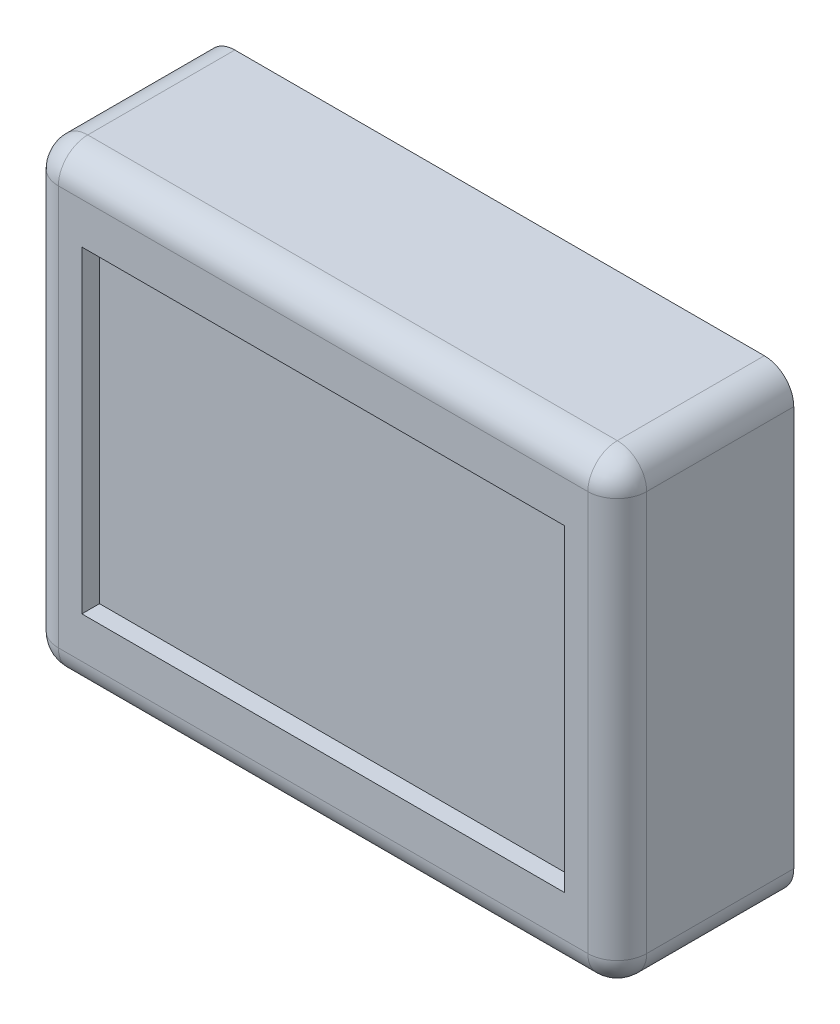
ISO-10303-21;
HEADER;
FILE_DESCRIPTION(('STEP AP214'),'2;1');
FILE_NAME('part.step','',(''),(''),'','','');
FILE_SCHEMA(('AUTOMOTIVE_DESIGN { 1 0 10303 214 1 1 1 1 }'));
ENDSEC;
DATA;
#1=APPLICATION_CONTEXT('core data for automotive mechanical design processes');
#2=APPLICATION_PROTOCOL_DEFINITION('international standard','automotive_design',2000,#1);
#3=PRODUCT_CONTEXT('',#1,'mechanical');
#4=PRODUCT('Part','Part','',(#3));
#5=PRODUCT_RELATED_PRODUCT_CATEGORY('part','',(#4));
#6=PRODUCT_DEFINITION_FORMATION('','',#4);
#7=PRODUCT_DEFINITION_CONTEXT('part definition',#1,'design');
#8=PRODUCT_DEFINITION('design','',#6,#7);
#9=PRODUCT_DEFINITION_SHAPE('','',#8);
#10=(LENGTH_UNIT() NAMED_UNIT(*) SI_UNIT(.MILLI.,.METRE.));
#11=(NAMED_UNIT(*) PLANE_ANGLE_UNIT() SI_UNIT($,.RADIAN.));
#12=(NAMED_UNIT(*) SI_UNIT($,.STERADIAN.) SOLID_ANGLE_UNIT());
#13=UNCERTAINTY_MEASURE_WITH_UNIT(LENGTH_MEASURE(1.E-05),#10,'distance_accuracy_value','');
#14=(GEOMETRIC_REPRESENTATION_CONTEXT(3) GLOBAL_UNCERTAINTY_ASSIGNED_CONTEXT((#13)) GLOBAL_UNIT_ASSIGNED_CONTEXT((#10,
#11,#12)) REPRESENTATION_CONTEXT('',''));
#15=CARTESIAN_POINT('',(0.,0.,0.));
#16=DIRECTION('',(0.,0.,1.));
#17=DIRECTION('',(1.,0.,0.));
#18=AXIS2_PLACEMENT_3D('',#15,#16,#17);
#19=CARTESIAN_POINT('',(58.1192235973719,-23.7460815047022,-30.));
#20=DIRECTION('',(1.,0.,0.));
#21=DIRECTION('',(0.,1.,0.));
#22=AXIS2_PLACEMENT_3D('',#19,#20,#21);
#23=PLANE('',#22);
#24=DIRECTION('',(0.,1.,0.));
#25=VECTOR('',#24,1.);
#26=CARTESIAN_POINT('',(58.1192235973719,-23.7460815047022,-5.));
#27=LINE('',#26,#25);
#28=CARTESIAN_POINT('',(58.1192235973719,49.2539184952978,-5.));
#29=VERTEX_POINT('',#28);
#30=CARTESIAN_POINT('',(58.1192235973719,-18.7460815047022,-5.));
#31=VERTEX_POINT('',#30);
#32=EDGE_CURVE('E324',#29,#31,#27,.F.);
#33=ORIENTED_EDGE('',*,*,#32,.T.);
#34=DIRECTION('',(0.,0.,1.));
#35=VECTOR('',#34,1.);
#36=CARTESIAN_POINT('',(58.1192235973719,-18.7460815047022,-30.));
#37=LINE('',#36,#35);
#38=CARTESIAN_POINT('',(58.1192235973719,-18.7460815047022,-30.));
#39=VERTEX_POINT('',#38);
#40=EDGE_CURVE('E328',#31,#39,#37,.F.);
#41=ORIENTED_EDGE('',*,*,#40,.T.);
#42=DIRECTION('',(0.,1.,0.));
#43=VECTOR('',#42,1.);
#44=CARTESIAN_POINT('',(58.1192235973719,-23.7460815047022,-30.));
#45=LINE('',#44,#43);
#46=CARTESIAN_POINT('',(58.1192235973719,49.2539184952978,-30.));
#47=VERTEX_POINT('',#46);
#48=EDGE_CURVE('E299',#39,#47,#45,.T.);
#49=ORIENTED_EDGE('',*,*,#48,.T.);
#50=DIRECTION('',(0.,0.,1.));
#51=VECTOR('',#50,1.);
#52=CARTESIAN_POINT('',(58.1192235973719,49.2539184952978,-30.));
#53=LINE('',#52,#51);
#54=EDGE_CURVE('E326',#47,#29,#53,.T.);
#55=ORIENTED_EDGE('',*,*,#54,.T.);
#56=EDGE_LOOP('',(#33,#41,#49,#55));
#57=FACE_BOUND('',#56,.T.);
#58=ADVANCED_FACE('F39',(#57),#23,.T.);
#59=CARTESIAN_POINT('',(-41.8807764026281,-23.7460815047022,-30.));
#60=DIRECTION('',(0.,-1.,0.));
#61=DIRECTION('',(0.,0.,-1.));
#62=AXIS2_PLACEMENT_3D('',#59,#60,#61);
#63=PLANE('',#62);
#64=DIRECTION('',(1.,0.,0.));
#65=VECTOR('',#64,1.);
#66=CARTESIAN_POINT('',(-41.8807764026281,-23.7460815047022,-30.));
#67=LINE('',#66,#65);
#68=CARTESIAN_POINT('',(-36.8807764026281,-23.7460815047022,-30.));
#69=VERTEX_POINT('',#68);
#70=CARTESIAN_POINT('',(53.1192235973719,-23.7460815047022,-30.));
#71=VERTEX_POINT('',#70);
#72=EDGE_CURVE('E314',#69,#71,#67,.T.);
#73=ORIENTED_EDGE('',*,*,#72,.T.);
#74=DIRECTION('',(0.,0.,1.));
#75=VECTOR('',#74,1.);
#76=CARTESIAN_POINT('',(53.1192235973719,-23.7460815047022,-30.));
#77=LINE('',#76,#75);
#78=CARTESIAN_POINT('',(53.1192235973719,-23.7460815047022,-5.));
#79=VERTEX_POINT('',#78);
#80=EDGE_CURVE('E321',#71,#79,#77,.T.);
#81=ORIENTED_EDGE('',*,*,#80,.T.);
#82=DIRECTION('',(1.,0.,0.));
#83=VECTOR('',#82,1.);
#84=CARTESIAN_POINT('',(-41.8807764026281,-23.7460815047022,-5.));
#85=LINE('',#84,#83);
#86=CARTESIAN_POINT('',(-36.8807764026281,-23.7460815047022,-5.));
#87=VERTEX_POINT('',#86);
#88=EDGE_CURVE('E319',#79,#87,#85,.F.);
#89=ORIENTED_EDGE('',*,*,#88,.T.);
#90=DIRECTION('',(0.,0.,1.));
#91=VECTOR('',#90,1.);
#92=CARTESIAN_POINT('',(-36.8807764026281,-23.7460815047022,-30.));
#93=LINE('',#92,#91);
#94=EDGE_CURVE('E317',#87,#69,#93,.F.);
#95=ORIENTED_EDGE('',*,*,#94,.T.);
#96=EDGE_LOOP('',(#73,#81,#89,#95));
#97=FACE_BOUND('',#96,.T.);
#98=ADVANCED_FACE('F445',(#97),#63,.T.);
#99=CARTESIAN_POINT('',(-41.8807764026281,54.2539184952978,-30.));
#100=DIRECTION('',(-1.,0.,0.));
#101=DIRECTION('',(0.,-1.,0.));
#102=AXIS2_PLACEMENT_3D('',#99,#100,#101);
#103=PLANE('',#102);
#104=DIRECTION('',(0.,-1.,0.));
#105=VECTOR('',#104,1.);
#106=CARTESIAN_POINT('',(-41.8807764026281,54.2539184952978,-30.));
#107=LINE('',#106,#105);
#108=CARTESIAN_POINT('',(-41.8807764026281,49.2539184952978,-30.));
#109=VERTEX_POINT('',#108);
#110=CARTESIAN_POINT('',(-41.8807764026281,-18.7460815047022,-30.));
#111=VERTEX_POINT('',#110);
#112=EDGE_CURVE('E311',#109,#111,#107,.T.);
#113=ORIENTED_EDGE('',*,*,#112,.T.);
#114=DIRECTION('',(0.,0.,1.));
#115=VECTOR('',#114,1.);
#116=CARTESIAN_POINT('',(-41.8807764026281,-18.7460815047022,-30.));
#117=LINE('',#116,#115);
#118=CARTESIAN_POINT('',(-41.8807764026281,-18.7460815047022,-5.));
#119=VERTEX_POINT('',#118);
#120=EDGE_CURVE('E351',#111,#119,#117,.T.);
#121=ORIENTED_EDGE('',*,*,#120,.T.);
#122=DIRECTION('',(0.,-1.,0.));
#123=VECTOR('',#122,1.);
#124=CARTESIAN_POINT('',(-41.8807764026281,54.2539184952978,-5.));
#125=LINE('',#124,#123);
#126=CARTESIAN_POINT('',(-41.8807764026281,49.2539184952978,-5.));
#127=VERTEX_POINT('',#126);
#128=EDGE_CURVE('E349',#119,#127,#125,.F.);
#129=ORIENTED_EDGE('',*,*,#128,.T.);
#130=DIRECTION('',(0.,0.,1.));
#131=VECTOR('',#130,1.);
#132=CARTESIAN_POINT('',(-41.8807764026281,49.2539184952978,-30.));
#133=LINE('',#132,#131);
#134=EDGE_CURVE('E347',#127,#109,#133,.F.);
#135=ORIENTED_EDGE('',*,*,#134,.T.);
#136=EDGE_LOOP('',(#113,#121,#129,#135));
#137=FACE_BOUND('',#136,.T.);
#138=ADVANCED_FACE('F452',(#137),#103,.T.);
#139=CARTESIAN_POINT('',(58.1192235973719,54.2539184952978,-30.));
#140=DIRECTION('',(0.,1.,0.));
#141=DIRECTION('',(-1.,0.,0.));
#142=AXIS2_PLACEMENT_3D('',#139,#140,#141);
#143=PLANE('',#142);
#144=DIRECTION('',(-1.,0.,0.));
#145=VECTOR('',#144,1.);
#146=CARTESIAN_POINT('',(58.1192235973719,54.2539184952978,-30.));
#147=LINE('',#146,#145);
#148=CARTESIAN_POINT('',(53.1192235973719,54.2539184952978,-30.));
#149=VERTEX_POINT('',#148);
#150=CARTESIAN_POINT('',(-36.8807764026281,54.2539184952978,-30.));
#151=VERTEX_POINT('',#150);
#152=EDGE_CURVE('E308',#149,#151,#147,.T.);
#153=ORIENTED_EDGE('',*,*,#152,.T.);
#154=DIRECTION('',(0.,0.,1.));
#155=VECTOR('',#154,1.);
#156=CARTESIAN_POINT('',(-36.8807764026281,54.2539184952978,-30.));
#157=LINE('',#156,#155);
#158=CARTESIAN_POINT('',(-36.8807764026281,54.2539184952978,-5.));
#159=VERTEX_POINT('',#158);
#160=EDGE_CURVE('E357',#151,#159,#157,.T.);
#161=ORIENTED_EDGE('',*,*,#160,.T.);
#162=DIRECTION('',(-1.,0.,0.));
#163=VECTOR('',#162,1.);
#164=CARTESIAN_POINT('',(58.1192235973719,54.2539184952978,-5.));
#165=LINE('',#164,#163);
#166=CARTESIAN_POINT('',(53.1192235973719,54.2539184952978,-5.));
#167=VERTEX_POINT('',#166);
#168=EDGE_CURVE('E353',#159,#167,#165,.F.);
#169=ORIENTED_EDGE('',*,*,#168,.T.);
#170=DIRECTION('',(0.,0.,1.));
#171=VECTOR('',#170,1.);
#172=CARTESIAN_POINT('',(53.1192235973719,54.2539184952978,-30.));
#173=LINE('',#172,#171);
#174=EDGE_CURVE('E355',#167,#149,#173,.F.);
#175=ORIENTED_EDGE('',*,*,#174,.T.);
#176=EDGE_LOOP('',(#153,#161,#169,#175));
#177=FACE_BOUND('',#176,.T.);
#178=ADVANCED_FACE('F457',(#177),#143,.T.);
#179=CARTESIAN_POINT('',(0.,0.,-30.));
#180=DIRECTION('',(0.,0.,1.));
#181=DIRECTION('',(1.,0.,0.));
#182=AXIS2_PLACEMENT_3D('',#179,#180,#181);
#183=PLANE('',#182);
#184=DIRECTION('',(1.,0.,0.));
#185=VECTOR('',#184,1.);
#186=CARTESIAN_POINT('',(0.,-20.7460815047022,-30.));
#187=LINE('',#186,#185);
#188=CARTESIAN_POINT('',(-38.8807764026281,-20.7460815047022,-30.));
#189=VERTEX_POINT('',#188);
#190=CARTESIAN_POINT('',(55.1192235973719,-20.7460815047022,-30.));
#191=VERTEX_POINT('',#190);
#192=EDGE_CURVE('E221',#189,#191,#187,.T.);
#193=ORIENTED_EDGE('',*,*,#192,.T.);
#194=DIRECTION('',(0.,1.,0.));
#195=VECTOR('',#194,1.);
#196=CARTESIAN_POINT('',(55.1192235973719,0.,-30.));
#197=LINE('',#196,#195);
#198=CARTESIAN_POINT('',(55.1192235973719,51.2539184952978,-30.));
#199=VERTEX_POINT('',#198);
#200=EDGE_CURVE('E230',#191,#199,#197,.T.);
#201=ORIENTED_EDGE('',*,*,#200,.T.);
#202=DIRECTION('',(-1.,0.,0.));
#203=VECTOR('',#202,1.);
#204=CARTESIAN_POINT('',(0.,51.2539184952978,-30.));
#205=LINE('',#204,#203);
#206=CARTESIAN_POINT('',(-38.8807764026281,51.2539184952978,-30.));
#207=VERTEX_POINT('',#206);
#208=EDGE_CURVE('E233',#199,#207,#205,.T.);
#209=ORIENTED_EDGE('',*,*,#208,.T.);
#210=DIRECTION('',(0.,-1.,0.));
#211=VECTOR('',#210,1.);
#212=CARTESIAN_POINT('',(-38.8807764026281,0.,-30.));
#213=LINE('',#212,#211);
#214=EDGE_CURVE('E269',#207,#189,#213,.T.);
#215=ORIENTED_EDGE('',*,*,#214,.T.);
#216=EDGE_LOOP('',(#193,#201,#209,#215));
#217=FACE_BOUND('',#216,.T.);
#218=ORIENTED_EDGE('',*,*,#48,.F.);
#219=CARTESIAN_POINT('',(53.1192235973719,-18.7460815047022,-30.));
#220=DIRECTION('',(0.,0.,1.));
#221=DIRECTION('',(1.,0.,0.));
#222=AXIS2_PLACEMENT_3D('',#219,#220,#221);
#223=CIRCLE('',#222,5.);
#224=EDGE_CURVE('E336',#39,#71,#223,.F.);
#225=ORIENTED_EDGE('',*,*,#224,.T.);
#226=ORIENTED_EDGE('',*,*,#72,.F.);
#227=CARTESIAN_POINT('',(-36.8807764026281,-18.7460815047022,-30.));
#228=DIRECTION('',(0.,0.,1.));
#229=DIRECTION('',(1.,0.,0.));
#230=AXIS2_PLACEMENT_3D('',#227,#228,#229);
#231=CIRCLE('',#230,5.);
#232=EDGE_CURVE('E334',#69,#111,#231,.F.);
#233=ORIENTED_EDGE('',*,*,#232,.T.);
#234=ORIENTED_EDGE('',*,*,#112,.F.);
#235=CARTESIAN_POINT('',(-36.8807764026281,49.2539184952978,-30.));
#236=DIRECTION('',(0.,0.,1.));
#237=DIRECTION('',(1.,0.,0.));
#238=AXIS2_PLACEMENT_3D('',#235,#236,#237);
#239=CIRCLE('',#238,5.);
#240=EDGE_CURVE('E332',#109,#151,#239,.F.);
#241=ORIENTED_EDGE('',*,*,#240,.T.);
#242=ORIENTED_EDGE('',*,*,#152,.F.);
#243=CARTESIAN_POINT('',(53.1192235973719,49.2539184952978,-30.));
#244=DIRECTION('',(0.,0.,1.));
#245=DIRECTION('',(1.,0.,0.));
#246=AXIS2_PLACEMENT_3D('',#243,#244,#245);
#247=CIRCLE('',#246,5.);
#248=EDGE_CURVE('E330',#149,#47,#247,.F.);
#249=ORIENTED_EDGE('',*,*,#248,.T.);
#250=EDGE_LOOP('',(#218,#225,#226,#233,#234,#241,#242,#249));
#251=FACE_BOUND('',#250,.T.);
#252=ADVANCED_FACE('F709',(#217,#251),#183,.F.);
#253=CARTESIAN_POINT('',(0.,0.,0.));
#254=DIRECTION('',(0.,0.,1.));
#255=DIRECTION('',(1.,0.,0.));
#256=AXIS2_PLACEMENT_3D('',#253,#254,#255);
#257=PLANE('',#256);
#258=DIRECTION('',(0.,-1.,0.));
#259=VECTOR('',#258,1.);
#260=CARTESIAN_POINT('',(-36.8807764026281,0.,0.));
#261=LINE('',#260,#259);
#262=CARTESIAN_POINT('',(-36.8807764026281,49.2539184952978,0.));
#263=VERTEX_POINT('',#262);
#264=CARTESIAN_POINT('',(-36.8807764026281,-18.7460815047022,0.));
#265=VERTEX_POINT('',#264);
#266=EDGE_CURVE('E342',#263,#265,#261,.T.);
#267=ORIENTED_EDGE('',*,*,#266,.T.);
#268=DIRECTION('',(1.,0.,0.));
#269=VECTOR('',#268,1.);
#270=CARTESIAN_POINT('',(0.,-18.7460815047022,0.));
#271=LINE('',#270,#269);
#272=CARTESIAN_POINT('',(53.1192235973719,-18.7460815047022,0.));
#273=VERTEX_POINT('',#272);
#274=EDGE_CURVE('E344',#265,#273,#271,.T.);
#275=ORIENTED_EDGE('',*,*,#274,.T.);
#276=DIRECTION('',(0.,1.,0.));
#277=VECTOR('',#276,1.);
#278=CARTESIAN_POINT('',(53.1192235973719,0.,0.));
#279=LINE('',#278,#277);
#280=CARTESIAN_POINT('',(53.1192235973719,49.2539184952978,0.));
#281=VERTEX_POINT('',#280);
#282=EDGE_CURVE('E338',#273,#281,#279,.T.);
#283=ORIENTED_EDGE('',*,*,#282,.T.);
#284=DIRECTION('',(-1.,0.,0.));
#285=VECTOR('',#284,1.);
#286=CARTESIAN_POINT('',(0.,49.2539184952978,0.));
#287=LINE('',#286,#285);
#288=EDGE_CURVE('E340',#281,#263,#287,.T.);
#289=ORIENTED_EDGE('',*,*,#288,.T.);
#290=EDGE_LOOP('',(#267,#275,#283,#289));
#291=FACE_BOUND('',#290,.T.);
#292=DIRECTION('',(0.,1.,0.));
#293=VECTOR('',#292,1.);
#294=CARTESIAN_POINT('',(49.1192235973719,-11.7460815047022,0.));
#295=LINE('',#294,#293);
#296=CARTESIAN_POINT('',(49.1192235973719,-11.7460815047022,0.));
#297=VERTEX_POINT('',#296);
#298=CARTESIAN_POINT('',(49.1192235973719,42.2539184952978,0.));
#299=VERTEX_POINT('',#298);
#300=EDGE_CURVE('E287',#297,#299,#295,.T.);
#301=ORIENTED_EDGE('',*,*,#300,.F.);
#302=DIRECTION('',(1.,0.,0.));
#303=VECTOR('',#302,1.);
#304=CARTESIAN_POINT('',(-32.8807764026281,-11.7460815047022,0.));
#305=LINE('',#304,#303);
#306=CARTESIAN_POINT('',(-32.8807764026281,-11.7460815047022,0.));
#307=VERTEX_POINT('',#306);
#308=EDGE_CURVE('E277',#307,#297,#305,.T.);
#309=ORIENTED_EDGE('',*,*,#308,.F.);
#310=DIRECTION('',(0.,-1.,0.));
#311=VECTOR('',#310,1.);
#312=CARTESIAN_POINT('',(-32.8807764026281,42.2539184952978,0.));
#313=LINE('',#312,#311);
#314=CARTESIAN_POINT('',(-32.8807764026281,42.2539184952978,0.));
#315=VERTEX_POINT('',#314);
#316=EDGE_CURVE('E292',#315,#307,#313,.T.);
#317=ORIENTED_EDGE('',*,*,#316,.F.);
#318=DIRECTION('',(-1.,0.,0.));
#319=VECTOR('',#318,1.);
#320=CARTESIAN_POINT('',(49.1192235973719,42.2539184952978,0.));
#321=LINE('',#320,#319);
#322=EDGE_CURVE('E289',#299,#315,#321,.T.);
#323=ORIENTED_EDGE('',*,*,#322,.F.);
#324=EDGE_LOOP('',(#301,#309,#317,#323));
#325=FACE_BOUND('',#324,.T.);
#326=ADVANCED_FACE('F701',(#291,#325),#257,.T.);
#327=CARTESIAN_POINT('',(49.1192235973719,-11.7460815047022,-3.));
#328=DIRECTION('',(1.,0.,0.));
#329=DIRECTION('',(0.,0.,-1.));
#330=AXIS2_PLACEMENT_3D('',#327,#328,#329);
#331=PLANE('',#330);
#332=ORIENTED_EDGE('',*,*,#300,.T.);
#333=DIRECTION('',(0.,0.,1.));
#334=VECTOR('',#333,1.);
#335=CARTESIAN_POINT('',(49.1192235973719,42.2539184952978,-3.));
#336=LINE('',#335,#334);
#337=CARTESIAN_POINT('',(49.1192235973719,42.2539184952978,-3.));
#338=VERTEX_POINT('',#337);
#339=EDGE_CURVE('E286',#338,#299,#336,.T.);
#340=ORIENTED_EDGE('',*,*,#339,.F.);
#341=DIRECTION('',(0.,1.,0.));
#342=VECTOR('',#341,1.);
#343=CARTESIAN_POINT('',(49.1192235973719,-11.7460815047022,-3.));
#344=LINE('',#343,#342);
#345=CARTESIAN_POINT('',(49.1192235973719,-11.7460815047022,-3.));
#346=VERTEX_POINT('',#345);
#347=EDGE_CURVE('E273',#346,#338,#344,.T.);
#348=ORIENTED_EDGE('',*,*,#347,.F.);
#349=DIRECTION('',(0.,0.,1.));
#350=VECTOR('',#349,1.);
#351=CARTESIAN_POINT('',(49.1192235973719,-11.7460815047022,-3.));
#352=LINE('',#351,#350);
#353=EDGE_CURVE('E297',#346,#297,#352,.T.);
#354=ORIENTED_EDGE('',*,*,#353,.T.);
#355=EDGE_LOOP('',(#332,#340,#348,#354));
#356=FACE_BOUND('',#355,.T.);
#357=ADVANCED_FACE('F692',(#356),#331,.F.);
#358=CARTESIAN_POINT('',(-32.8807764026281,-11.7460815047022,-3.));
#359=DIRECTION('',(0.,-1.,0.));
#360=DIRECTION('',(0.,0.,-1.));
#361=AXIS2_PLACEMENT_3D('',#358,#359,#360);
#362=PLANE('',#361);
#363=ORIENTED_EDGE('',*,*,#308,.T.);
#364=ORIENTED_EDGE('',*,*,#353,.F.);
#365=DIRECTION('',(1.,0.,0.));
#366=VECTOR('',#365,1.);
#367=CARTESIAN_POINT('',(-32.8807764026281,-11.7460815047022,-3.));
#368=LINE('',#367,#366);
#369=CARTESIAN_POINT('',(-32.8807764026281,-11.7460815047022,-3.));
#370=VERTEX_POINT('',#369);
#371=EDGE_CURVE('E283',#370,#346,#368,.T.);
#372=ORIENTED_EDGE('',*,*,#371,.F.);
#373=DIRECTION('',(0.,0.,1.));
#374=VECTOR('',#373,1.);
#375=CARTESIAN_POINT('',(-32.8807764026281,-11.7460815047022,-3.));
#376=LINE('',#375,#374);
#377=EDGE_CURVE('E300',#370,#307,#376,.T.);
#378=ORIENTED_EDGE('',*,*,#377,.T.);
#379=EDGE_LOOP('',(#363,#364,#372,#378));
#380=FACE_BOUND('',#379,.T.);
#381=ADVANCED_FACE('F683',(#380),#362,.F.);
#382=CARTESIAN_POINT('',(-32.8807764026281,42.2539184952978,-3.));
#383=DIRECTION('',(-1.,0.,0.));
#384=DIRECTION('',(0.,-1.,0.));
#385=AXIS2_PLACEMENT_3D('',#382,#383,#384);
#386=PLANE('',#385);
#387=ORIENTED_EDGE('',*,*,#316,.T.);
#388=ORIENTED_EDGE('',*,*,#377,.F.);
#389=DIRECTION('',(0.,-1.,0.));
#390=VECTOR('',#389,1.);
#391=CARTESIAN_POINT('',(-32.8807764026281,42.2539184952978,-3.));
#392=LINE('',#391,#390);
#393=CARTESIAN_POINT('',(-32.8807764026281,42.2539184952978,-3.));
#394=VERTEX_POINT('',#393);
#395=EDGE_CURVE('E280',#394,#370,#392,.T.);
#396=ORIENTED_EDGE('',*,*,#395,.F.);
#397=DIRECTION('',(0.,0.,1.));
#398=VECTOR('',#397,1.);
#399=CARTESIAN_POINT('',(-32.8807764026281,42.2539184952978,-3.));
#400=LINE('',#399,#398);
#401=EDGE_CURVE('E302',#394,#315,#400,.T.);
#402=ORIENTED_EDGE('',*,*,#401,.T.);
#403=EDGE_LOOP('',(#387,#388,#396,#402));
#404=FACE_BOUND('',#403,.T.);
#405=ADVANCED_FACE('F674',(#404),#386,.F.);
#406=CARTESIAN_POINT('',(49.1192235973719,42.2539184952978,-3.));
#407=DIRECTION('',(0.,1.,0.));
#408=DIRECTION('',(-1.,0.,0.));
#409=AXIS2_PLACEMENT_3D('',#406,#407,#408);
#410=PLANE('',#409);
#411=ORIENTED_EDGE('',*,*,#322,.T.);
#412=ORIENTED_EDGE('',*,*,#401,.F.);
#413=DIRECTION('',(-1.,0.,0.));
#414=VECTOR('',#413,1.);
#415=CARTESIAN_POINT('',(49.1192235973719,42.2539184952978,-3.));
#416=LINE('',#415,#414);
#417=EDGE_CURVE('E276',#338,#394,#416,.T.);
#418=ORIENTED_EDGE('',*,*,#417,.F.);
#419=ORIENTED_EDGE('',*,*,#339,.T.);
#420=EDGE_LOOP('',(#411,#412,#418,#419));
#421=FACE_BOUND('',#420,.T.);
#422=ADVANCED_FACE('F666',(#421),#410,.F.);
#423=CARTESIAN_POINT('',(0.,0.,-3.));
#424=DIRECTION('',(0.,0.,1.));
#425=DIRECTION('',(1.,0.,0.));
#426=AXIS2_PLACEMENT_3D('',#423,#424,#425);
#427=PLANE('',#426);
#428=ORIENTED_EDGE('',*,*,#347,.T.);
#429=ORIENTED_EDGE('',*,*,#417,.T.);
#430=ORIENTED_EDGE('',*,*,#395,.T.);
#431=ORIENTED_EDGE('',*,*,#371,.T.);
#432=EDGE_LOOP('',(#428,#429,#430,#431));
#433=FACE_BOUND('',#432,.T.);
#434=ADVANCED_FACE('F543',(#433),#427,.T.);
#435=CARTESIAN_POINT('',(55.1192235973719,-23.7460815047022,-30.));
#436=DIRECTION('',(1.,0.,0.));
#437=DIRECTION('',(0.,1.,0.));
#438=AXIS2_PLACEMENT_3D('',#435,#436,#437);
#439=PLANE('',#438);
#440=DIRECTION('',(0.,0.,1.));
#441=VECTOR('',#440,1.);
#442=CARTESIAN_POINT('',(55.1192235973719,-20.7460815047022,-30.));
#443=LINE('',#442,#441);
#444=CARTESIAN_POINT('',(55.1192235973719,-20.7460815047022,-8.));
#445=VERTEX_POINT('',#444);
#446=EDGE_CURVE('E223',#191,#445,#443,.T.);
#447=ORIENTED_EDGE('',*,*,#446,.T.);
#448=DIRECTION('',(0.,1.,0.));
#449=VECTOR('',#448,1.);
#450=CARTESIAN_POINT('',(55.1192235973719,51.2539184952978,-8.));
#451=LINE('',#450,#449);
#452=CARTESIAN_POINT('',(55.1192235973719,51.2539184952978,-8.));
#453=VERTEX_POINT('',#452);
#454=EDGE_CURVE('E359',#445,#453,#451,.T.);
#455=ORIENTED_EDGE('',*,*,#454,.T.);
#456=DIRECTION('',(0.,0.,1.));
#457=VECTOR('',#456,1.);
#458=CARTESIAN_POINT('',(55.1192235973719,51.2539184952978,-30.));
#459=LINE('',#458,#457);
#460=EDGE_CURVE('E236',#199,#453,#459,.T.);
#461=ORIENTED_EDGE('',*,*,#460,.F.);
#462=ORIENTED_EDGE('',*,*,#200,.F.);
#463=EDGE_LOOP('',(#447,#455,#461,#462));
#464=FACE_BOUND('',#463,.T.);
#465=ADVANCED_FACE('F412',(#464),#439,.F.);
#466=CARTESIAN_POINT('',(-41.8807764026281,-20.7460815047022,-30.));
#467=DIRECTION('',(0.,-1.,0.));
#468=DIRECTION('',(0.,0.,-1.));
#469=AXIS2_PLACEMENT_3D('',#466,#467,#468);
#470=PLANE('',#469);
#471=DIRECTION('',(1.,0.,0.));
#472=VECTOR('',#471,1.);
#473=CARTESIAN_POINT('',(0.,-20.7460815047022,-3.));
#474=LINE('',#473,#472);
#475=CARTESIAN_POINT('',(-38.8807764026281,-20.7460815047022,-3.));
#476=VERTEX_POINT('',#475);
#477=CARTESIAN_POINT('',(50.1192235973719,-20.7460815047022,-3.));
#478=VERTEX_POINT('',#477);
#479=EDGE_CURVE('E213',#476,#478,#474,.T.);
#480=ORIENTED_EDGE('',*,*,#479,.T.);
#481=CARTESIAN_POINT('',(50.1192235973719,-20.7460815047022,-8.));
#482=DIRECTION('',(0.,-1.,0.));
#483=DIRECTION('',(0.,0.,-1.));
#484=AXIS2_PLACEMENT_3D('',#481,#482,#483);
#485=CIRCLE('',#484,5.);
#486=EDGE_CURVE('E405',#478,#445,#485,.F.);
#487=ORIENTED_EDGE('',*,*,#486,.T.);
#488=ORIENTED_EDGE('',*,*,#446,.F.);
#489=ORIENTED_EDGE('',*,*,#192,.F.);
#490=DIRECTION('',(0.,0.,1.));
#491=VECTOR('',#490,1.);
#492=CARTESIAN_POINT('',(-38.8807764026281,-20.7460815047022,-30.));
#493=LINE('',#492,#491);
#494=EDGE_CURVE('E207',#189,#476,#493,.T.);
#495=ORIENTED_EDGE('',*,*,#494,.T.);
#496=EDGE_LOOP('',(#480,#487,#488,#489,#495));
#497=FACE_BOUND('',#496,.T.);
#498=ADVANCED_FACE('F218',(#497),#470,.F.);
#499=CARTESIAN_POINT('',(-38.8807764026281,54.2539184952978,-30.));
#500=DIRECTION('',(-1.,0.,0.));
#501=DIRECTION('',(0.,-1.,0.));
#502=AXIS2_PLACEMENT_3D('',#499,#500,#501);
#503=PLANE('',#502);
#504=DIRECTION('',(0.,0.,1.));
#505=VECTOR('',#504,1.);
#506=CARTESIAN_POINT('',(-38.8807764026281,51.2539184952978,-30.));
#507=LINE('',#506,#505);
#508=CARTESIAN_POINT('',(-38.8807764026281,51.2539184952978,-8.));
#509=VERTEX_POINT('',#508);
#510=EDGE_CURVE('E224',#207,#509,#507,.T.);
#511=ORIENTED_EDGE('',*,*,#510,.T.);
#512=CARTESIAN_POINT('',(-38.8807764026281,46.2539184952978,-8.));
#513=DIRECTION('',(-1.,0.,0.));
#514=DIRECTION('',(0.,-1.,0.));
#515=AXIS2_PLACEMENT_3D('',#512,#513,#514);
#516=CIRCLE('',#515,5.);
#517=CARTESIAN_POINT('',(-38.8807764026281,46.2539184952978,-3.));
#518=VERTEX_POINT('',#517);
#519=EDGE_CURVE('E11',#509,#518,#516,.F.);
#520=ORIENTED_EDGE('',*,*,#519,.T.);
#521=DIRECTION('',(0.,-1.,0.));
#522=VECTOR('',#521,1.);
#523=CARTESIAN_POINT('',(-38.8807764026281,0.,-3.));
#524=LINE('',#523,#522);
#525=EDGE_CURVE('E204',#518,#476,#524,.T.);
#526=ORIENTED_EDGE('',*,*,#525,.T.);
#527=ORIENTED_EDGE('',*,*,#494,.F.);
#528=ORIENTED_EDGE('',*,*,#214,.F.);
#529=EDGE_LOOP('',(#511,#520,#526,#527,#528));
#530=FACE_BOUND('',#529,.T.);
#531=ADVANCED_FACE('F206',(#530),#503,.F.);
#532=CARTESIAN_POINT('',(58.1192235973719,51.2539184952978,-30.));
#533=DIRECTION('',(0.,1.,0.));
#534=DIRECTION('',(-1.,0.,0.));
#535=AXIS2_PLACEMENT_3D('',#532,#533,#534);
#536=PLANE('',#535);
#537=ORIENTED_EDGE('',*,*,#460,.T.);
#538=DIRECTION('',(-1.,0.,0.));
#539=VECTOR('',#538,1.);
#540=CARTESIAN_POINT('',(-38.8807764026281,51.2539184952978,-8.));
#541=LINE('',#540,#539);
#542=EDGE_CURVE('E48',#453,#509,#541,.T.);
#543=ORIENTED_EDGE('',*,*,#542,.T.);
#544=ORIENTED_EDGE('',*,*,#510,.F.);
#545=ORIENTED_EDGE('',*,*,#208,.F.);
#546=EDGE_LOOP('',(#537,#543,#544,#545));
#547=FACE_BOUND('',#546,.T.);
#548=ADVANCED_FACE('F442',(#547),#536,.F.);
#549=CARTESIAN_POINT('',(0.,0.,-3.));
#550=DIRECTION('',(0.,0.,1.));
#551=DIRECTION('',(1.,0.,0.));
#552=AXIS2_PLACEMENT_3D('',#549,#550,#551);
#553=PLANE('',#552);
#554=DIRECTION('',(1.,0.,0.));
#555=VECTOR('',#554,1.);
#556=CARTESIAN_POINT('',(0.,-14.7460815047022,-3.));
#557=LINE('',#556,#555);
#558=CARTESIAN_POINT('',(-35.8807764026281,-14.7460815047022,-3.));
#559=VERTEX_POINT('',#558);
#560=CARTESIAN_POINT('',(50.1192235973719,-14.7460815047022,-3.));
#561=VERTEX_POINT('',#560);
#562=EDGE_CURVE('E240',#559,#561,#557,.T.);
#563=ORIENTED_EDGE('',*,*,#562,.T.);
#564=DIRECTION('',(0.,1.,0.));
#565=VECTOR('',#564,1.);
#566=CARTESIAN_POINT('',(50.1192235973719,-20.7460815047022,-3.));
#567=LINE('',#566,#565);
#568=EDGE_CURVE('E229',#561,#478,#567,.F.);
#569=ORIENTED_EDGE('',*,*,#568,.T.);
#570=ORIENTED_EDGE('',*,*,#479,.F.);
#571=ORIENTED_EDGE('',*,*,#525,.F.);
#572=DIRECTION('',(-1.,0.,0.));
#573=VECTOR('',#572,1.);
#574=CARTESIAN_POINT('',(55.1192235973719,46.2539184952978,-3.));
#575=LINE('',#574,#573);
#576=CARTESIAN_POINT('',(50.1192235973719,46.2539184952978,-3.));
#577=VERTEX_POINT('',#576);
#578=EDGE_CURVE('E395',#518,#577,#575,.F.);
#579=ORIENTED_EDGE('',*,*,#578,.T.);
#580=DIRECTION('',(0.,1.,0.));
#581=VECTOR('',#580,1.);
#582=CARTESIAN_POINT('',(50.1192235973719,-20.7460815047022,-3.));
#583=LINE('',#582,#581);
#584=CARTESIAN_POINT('',(50.1192235973719,45.2539184952978,-3.));
#585=VERTEX_POINT('',#584);
#586=EDGE_CURVE('E397',#577,#585,#583,.F.);
#587=ORIENTED_EDGE('',*,*,#586,.T.);
#588=DIRECTION('',(-1.,0.,0.));
#589=VECTOR('',#588,1.);
#590=CARTESIAN_POINT('',(0.,45.2539184952978,-3.));
#591=LINE('',#590,#589);
#592=CARTESIAN_POINT('',(-35.8807764026281,45.2539184952978,-3.));
#593=VERTEX_POINT('',#592);
#594=EDGE_CURVE('E246',#585,#593,#591,.T.);
#595=ORIENTED_EDGE('',*,*,#594,.T.);
#596=DIRECTION('',(0.,-1.,0.));
#597=VECTOR('',#596,1.);
#598=CARTESIAN_POINT('',(-35.8807764026281,0.,-3.));
#599=LINE('',#598,#597);
#600=EDGE_CURVE('E243',#593,#559,#599,.T.);
#601=ORIENTED_EDGE('',*,*,#600,.T.);
#602=EDGE_LOOP('',(#563,#569,#570,#571,#579,#587,#595,#601));
#603=FACE_BOUND('',#602,.T.);
#604=ADVANCED_FACE('F227',(#603),#553,.F.);
#605=CARTESIAN_POINT('',(52.1192235973719,-11.7460815047022,-3.));
#606=DIRECTION('',(1.,0.,0.));
#607=DIRECTION('',(0.,0.,-1.));
#608=AXIS2_PLACEMENT_3D('',#605,#606,#607);
#609=PLANE('',#608);
#610=DIRECTION('',(0.,0.,1.));
#611=VECTOR('',#610,1.);
#612=CARTESIAN_POINT('',(52.1192235973719,45.2539184952978,-3.));
#613=LINE('',#612,#611);
#614=CARTESIAN_POINT('',(52.1192235973719,45.2539184952978,-6.));
#615=VERTEX_POINT('',#614);
#616=CARTESIAN_POINT('',(52.1192235973719,45.2539184952978,-3.41742430504415));
#617=VERTEX_POINT('',#616);
#618=EDGE_CURVE('E249',#615,#617,#613,.T.);
#619=ORIENTED_EDGE('',*,*,#618,.T.);
#620=DIRECTION('',(0.,-1.,0.));
#621=VECTOR('',#620,1.);
#622=CARTESIAN_POINT('',(52.1192235973719,45.2539184952978,-3.41742430504415));
#623=LINE('',#622,#621);
#624=CARTESIAN_POINT('',(52.1192235973719,-14.7460815047022,-3.41742430504416));
#625=VERTEX_POINT('',#624);
#626=EDGE_CURVE('E62',#617,#625,#623,.T.);
#627=ORIENTED_EDGE('',*,*,#626,.T.);
#628=DIRECTION('',(0.,0.,1.));
#629=VECTOR('',#628,1.);
#630=CARTESIAN_POINT('',(52.1192235973719,-14.7460815047022,-3.));
#631=LINE('',#630,#629);
#632=CARTESIAN_POINT('',(52.1192235973719,-14.7460815047022,-6.));
#633=VERTEX_POINT('',#632);
#634=EDGE_CURVE('E214',#633,#625,#631,.T.);
#635=ORIENTED_EDGE('',*,*,#634,.F.);
#636=DIRECTION('',(0.,1.,0.));
#637=VECTOR('',#636,1.);
#638=CARTESIAN_POINT('',(52.1192235973719,0.,-6.));
#639=LINE('',#638,#637);
#640=EDGE_CURVE('E242',#633,#615,#639,.T.);
#641=ORIENTED_EDGE('',*,*,#640,.T.);
#642=EDGE_LOOP('',(#619,#627,#635,#641));
#643=FACE_BOUND('',#642,.T.);
#644=ADVANCED_FACE('F434',(#643),#609,.T.);
#645=CARTESIAN_POINT('',(-32.8807764026281,-14.7460815047022,-3.));
#646=DIRECTION('',(0.,-1.,0.));
#647=DIRECTION('',(0.,0.,-1.));
#648=AXIS2_PLACEMENT_3D('',#645,#646,#647);
#649=PLANE('',#648);
#650=ORIENTED_EDGE('',*,*,#634,.T.);
#651=CARTESIAN_POINT('',(50.1192235973719,-14.7460815047022,-8.));
#652=DIRECTION('',(0.,-1.,0.));
#653=DIRECTION('',(0.,0.,-1.));
#654=AXIS2_PLACEMENT_3D('',#651,#652,#653);
#655=CIRCLE('',#654,5.);
#656=EDGE_CURVE('E403',#625,#561,#655,.T.);
#657=ORIENTED_EDGE('',*,*,#656,.T.);
#658=ORIENTED_EDGE('',*,*,#562,.F.);
#659=DIRECTION('',(0.,0.,1.));
#660=VECTOR('',#659,1.);
#661=CARTESIAN_POINT('',(-35.8807764026281,-14.7460815047022,-3.));
#662=LINE('',#661,#660);
#663=CARTESIAN_POINT('',(-35.8807764026281,-14.7460815047022,-6.));
#664=VERTEX_POINT('',#663);
#665=EDGE_CURVE('E257',#664,#559,#662,.T.);
#666=ORIENTED_EDGE('',*,*,#665,.F.);
#667=DIRECTION('',(1.,0.,0.));
#668=VECTOR('',#667,1.);
#669=CARTESIAN_POINT('',(0.,-14.7460815047022,-6.));
#670=LINE('',#669,#668);
#671=EDGE_CURVE('E252',#664,#633,#670,.T.);
#672=ORIENTED_EDGE('',*,*,#671,.T.);
#673=EDGE_LOOP('',(#650,#657,#658,#666,#672));
#674=FACE_BOUND('',#673,.T.);
#675=ADVANCED_FACE('F425',(#674),#649,.T.);
#676=CARTESIAN_POINT('',(-35.8807764026281,42.2539184952978,-3.));
#677=DIRECTION('',(-1.,0.,0.));
#678=DIRECTION('',(0.,-1.,0.));
#679=AXIS2_PLACEMENT_3D('',#676,#677,#678);
#680=PLANE('',#679);
#681=ORIENTED_EDGE('',*,*,#600,.F.);
#682=DIRECTION('',(0.,0.,1.));
#683=VECTOR('',#682,1.);
#684=CARTESIAN_POINT('',(-35.8807764026281,45.2539184952978,-3.));
#685=LINE('',#684,#683);
#686=CARTESIAN_POINT('',(-35.8807764026281,45.2539184952978,-6.));
#687=VERTEX_POINT('',#686);
#688=EDGE_CURVE('E251',#687,#593,#685,.T.);
#689=ORIENTED_EDGE('',*,*,#688,.F.);
#690=DIRECTION('',(0.,-1.,0.));
#691=VECTOR('',#690,1.);
#692=CARTESIAN_POINT('',(-35.8807764026281,0.,-6.));
#693=LINE('',#692,#691);
#694=EDGE_CURVE('E260',#687,#664,#693,.T.);
#695=ORIENTED_EDGE('',*,*,#694,.T.);
#696=ORIENTED_EDGE('',*,*,#665,.T.);
#697=EDGE_LOOP('',(#681,#689,#695,#696));
#698=FACE_BOUND('',#697,.T.);
#699=ADVANCED_FACE('F427',(#698),#680,.T.);
#700=CARTESIAN_POINT('',(49.1192235973719,45.2539184952978,-3.));
#701=DIRECTION('',(0.,1.,0.));
#702=DIRECTION('',(-1.,0.,0.));
#703=AXIS2_PLACEMENT_3D('',#700,#701,#702);
#704=PLANE('',#703);
#705=ORIENTED_EDGE('',*,*,#594,.F.);
#706=CARTESIAN_POINT('',(50.1192235973719,45.2539184952978,-8.));
#707=DIRECTION('',(0.,1.,0.));
#708=DIRECTION('',(-1.,0.,0.));
#709=AXIS2_PLACEMENT_3D('',#706,#707,#708);
#710=CIRCLE('',#709,5.);
#711=EDGE_CURVE('E400',#585,#617,#710,.T.);
#712=ORIENTED_EDGE('',*,*,#711,.T.);
#713=ORIENTED_EDGE('',*,*,#618,.F.);
#714=DIRECTION('',(-1.,0.,0.));
#715=VECTOR('',#714,1.);
#716=CARTESIAN_POINT('',(0.,45.2539184952978,-6.));
#717=LINE('',#716,#715);
#718=EDGE_CURVE('E255',#615,#687,#717,.T.);
#719=ORIENTED_EDGE('',*,*,#718,.T.);
#720=ORIENTED_EDGE('',*,*,#688,.T.);
#721=EDGE_LOOP('',(#705,#712,#713,#719,#720));
#722=FACE_BOUND('',#721,.T.);
#723=ADVANCED_FACE('F420',(#722),#704,.T.);
#724=CARTESIAN_POINT('',(0.,0.,-6.));
#725=DIRECTION('',(0.,0.,1.));
#726=DIRECTION('',(1.,0.,0.));
#727=AXIS2_PLACEMENT_3D('',#724,#725,#726);
#728=PLANE('',#727);
#729=ORIENTED_EDGE('',*,*,#640,.F.);
#730=ORIENTED_EDGE('',*,*,#671,.F.);
#731=ORIENTED_EDGE('',*,*,#694,.F.);
#732=ORIENTED_EDGE('',*,*,#718,.F.);
#733=EDGE_LOOP('',(#729,#730,#731,#732));
#734=FACE_BOUND('',#733,.T.);
#735=ADVANCED_FACE('F432',(#734),#728,.F.);
#736=CARTESIAN_POINT('',(-36.8807764026281,49.2539184952978,-30.));
#737=DIRECTION('',(0.,0.,1.));
#738=DIRECTION('',(1.,0.,0.));
#739=AXIS2_PLACEMENT_3D('',#736,#737,#738);
#740=CYLINDRICAL_SURFACE('',#739,5.);
#741=CARTESIAN_POINT('',(-36.8807764026281,49.2539184952978,-5.));
#742=DIRECTION('',(0.,0.,1.));
#743=DIRECTION('',(1.,0.,0.));
#744=AXIS2_PLACEMENT_3D('',#741,#742,#743);
#745=CIRCLE('',#744,5.);
#746=EDGE_CURVE('E248',#159,#127,#745,.T.);
#747=ORIENTED_EDGE('',*,*,#746,.F.);
#748=ORIENTED_EDGE('',*,*,#160,.F.);
#749=ORIENTED_EDGE('',*,*,#240,.F.);
#750=ORIENTED_EDGE('',*,*,#134,.F.);
#751=EDGE_LOOP('',(#747,#748,#749,#750));
#752=FACE_BOUND('',#751,.T.);
#753=ADVANCED_FACE('F502',(#752),#740,.T.);
#754=CARTESIAN_POINT('',(-36.8807764026281,49.2539184952978,-5.));
#755=DIRECTION('',(-1.,0.,0.));
#756=DIRECTION('',(0.,0.,1.));
#757=AXIS2_PLACEMENT_3D('',#754,#755,#756);
#758=SPHERICAL_SURFACE('',#757,5.);
#759=CARTESIAN_POINT('',(-36.8807764026281,49.2539184952978,-5.));
#760=DIRECTION('',(-1.,0.,0.));
#761=DIRECTION('',(0.,-1.,0.));
#762=AXIS2_PLACEMENT_3D('',#759,#760,#761);
#763=CIRCLE('',#762,5.);
#764=EDGE_CURVE('E385',#159,#263,#763,.F.);
#765=ORIENTED_EDGE('',*,*,#764,.F.);
#766=ORIENTED_EDGE('',*,*,#746,.T.);
#767=CARTESIAN_POINT('',(-36.8807764026281,49.2539184952978,-5.));
#768=DIRECTION('',(0.,1.,0.));
#769=DIRECTION('',(0.,0.,1.));
#770=AXIS2_PLACEMENT_3D('',#767,#768,#769);
#771=CIRCLE('',#770,5.);
#772=EDGE_CURVE('E388',#263,#127,#771,.F.);
#773=ORIENTED_EDGE('',*,*,#772,.F.);
#774=EDGE_LOOP('',(#765,#766,#773));
#775=FACE_BOUND('',#774,.T.);
#776=ADVANCED_FACE('F498',(#775),#758,.T.);
#777=CARTESIAN_POINT('',(-36.8807764026281,-18.7460815047022,-30.));
#778=DIRECTION('',(0.,0.,1.));
#779=DIRECTION('',(1.,0.,0.));
#780=AXIS2_PLACEMENT_3D('',#777,#778,#779);
#781=CYLINDRICAL_SURFACE('',#780,5.);
#782=ORIENTED_EDGE('',*,*,#232,.F.);
#783=ORIENTED_EDGE('',*,*,#94,.F.);
#784=CARTESIAN_POINT('',(-36.8807764026281,-18.7460815047022,-5.));
#785=DIRECTION('',(0.,0.,1.));
#786=DIRECTION('',(1.,0.,0.));
#787=AXIS2_PLACEMENT_3D('',#784,#785,#786);
#788=CIRCLE('',#787,5.);
#789=EDGE_CURVE('E382',#119,#87,#788,.T.);
#790=ORIENTED_EDGE('',*,*,#789,.F.);
#791=ORIENTED_EDGE('',*,*,#120,.F.);
#792=EDGE_LOOP('',(#782,#783,#790,#791));
#793=FACE_BOUND('',#792,.T.);
#794=ADVANCED_FACE('F494',(#793),#781,.T.);
#795=CARTESIAN_POINT('',(-36.8807764026281,0.,-5.));
#796=DIRECTION('',(0.,-1.,0.));
#797=DIRECTION('',(1.,0.,0.));
#798=AXIS2_PLACEMENT_3D('',#795,#796,#797);
#799=CYLINDRICAL_SURFACE('',#798,5.);
#800=ORIENTED_EDGE('',*,*,#772,.T.);
#801=ORIENTED_EDGE('',*,*,#128,.F.);
#802=CARTESIAN_POINT('',(-36.8807764026281,-18.7460815047022,-5.));
#803=DIRECTION('',(0.,-1.,0.));
#804=DIRECTION('',(1.,0.,0.));
#805=AXIS2_PLACEMENT_3D('',#802,#803,#804);
#806=CIRCLE('',#805,5.);
#807=EDGE_CURVE('E379',#265,#119,#806,.T.);
#808=ORIENTED_EDGE('',*,*,#807,.F.);
#809=ORIENTED_EDGE('',*,*,#266,.F.);
#810=EDGE_LOOP('',(#800,#801,#808,#809));
#811=FACE_BOUND('',#810,.T.);
#812=ADVANCED_FACE('F490',(#811),#799,.T.);
#813=CARTESIAN_POINT('',(0.,49.2539184952978,-5.));
#814=DIRECTION('',(-1.,0.,0.));
#815=DIRECTION('',(0.,-1.,0.));
#816=AXIS2_PLACEMENT_3D('',#813,#814,#815);
#817=CYLINDRICAL_SURFACE('',#816,5.);
#818=ORIENTED_EDGE('',*,*,#764,.T.);
#819=ORIENTED_EDGE('',*,*,#288,.F.);
#820=CARTESIAN_POINT('',(53.1192235973719,49.2539184952978,-5.));
#821=DIRECTION('',(1.,0.,0.));
#822=DIRECTION('',(0.,0.,-1.));
#823=AXIS2_PLACEMENT_3D('',#820,#821,#822);
#824=CIRCLE('',#823,5.);
#825=EDGE_CURVE('E376',#167,#281,#824,.T.);
#826=ORIENTED_EDGE('',*,*,#825,.F.);
#827=ORIENTED_EDGE('',*,*,#168,.F.);
#828=EDGE_LOOP('',(#818,#819,#826,#827));
#829=FACE_BOUND('',#828,.T.);
#830=ADVANCED_FACE('F486',(#829),#817,.T.);
#831=CARTESIAN_POINT('',(53.1192235973719,49.2539184952978,-30.));
#832=DIRECTION('',(0.,0.,1.));
#833=DIRECTION('',(1.,0.,0.));
#834=AXIS2_PLACEMENT_3D('',#831,#832,#833);
#835=CYLINDRICAL_SURFACE('',#834,5.);
#836=ORIENTED_EDGE('',*,*,#248,.F.);
#837=ORIENTED_EDGE('',*,*,#174,.F.);
#838=CARTESIAN_POINT('',(53.1192235973719,49.2539184952978,-5.));
#839=DIRECTION('',(0.,0.,1.));
#840=DIRECTION('',(1.,0.,0.));
#841=AXIS2_PLACEMENT_3D('',#838,#839,#840);
#842=CIRCLE('',#841,5.);
#843=EDGE_CURVE('E373',#29,#167,#842,.T.);
#844=ORIENTED_EDGE('',*,*,#843,.F.);
#845=ORIENTED_EDGE('',*,*,#54,.F.);
#846=EDGE_LOOP('',(#836,#837,#844,#845));
#847=FACE_BOUND('',#846,.T.);
#848=ADVANCED_FACE('F482',(#847),#835,.T.);
#849=CARTESIAN_POINT('',(-36.8807764026281,-18.7460815047022,-5.));
#850=DIRECTION('',(-1.,0.,0.));
#851=DIRECTION('',(0.,-1.,0.));
#852=AXIS2_PLACEMENT_3D('',#849,#850,#851);
#853=SPHERICAL_SURFACE('',#852,5.);
#854=ORIENTED_EDGE('',*,*,#807,.T.);
#855=ORIENTED_EDGE('',*,*,#789,.T.);
#856=CARTESIAN_POINT('',(-36.8807764026281,-18.7460815047022,-5.));
#857=DIRECTION('',(-1.,0.,0.));
#858=DIRECTION('',(0.,0.,1.));
#859=AXIS2_PLACEMENT_3D('',#856,#857,#858);
#860=CIRCLE('',#859,5.);
#861=EDGE_CURVE('E370',#265,#87,#860,.F.);
#862=ORIENTED_EDGE('',*,*,#861,.F.);
#863=EDGE_LOOP('',(#854,#855,#862));
#864=FACE_BOUND('',#863,.T.);
#865=ADVANCED_FACE('F478',(#864),#853,.T.);
#866=CARTESIAN_POINT('',(53.1192235973719,49.2539184952978,-5.));
#867=DIRECTION('',(0.,1.,0.));
#868=DIRECTION('',(0.,0.,1.));
#869=AXIS2_PLACEMENT_3D('',#866,#867,#868);
#870=SPHERICAL_SURFACE('',#869,5.);
#871=ORIENTED_EDGE('',*,*,#843,.T.);
#872=ORIENTED_EDGE('',*,*,#825,.T.);
#873=CARTESIAN_POINT('',(53.1192235973719,49.2539184952978,-5.));
#874=DIRECTION('',(0.,1.,0.));
#875=DIRECTION('',(0.,0.,1.));
#876=AXIS2_PLACEMENT_3D('',#873,#874,#875);
#877=CIRCLE('',#876,5.);
#878=EDGE_CURVE('E367',#29,#281,#877,.F.);
#879=ORIENTED_EDGE('',*,*,#878,.F.);
#880=EDGE_LOOP('',(#871,#872,#879));
#881=FACE_BOUND('',#880,.T.);
#882=ADVANCED_FACE('F474',(#881),#870,.T.);
#883=CARTESIAN_POINT('',(0.,-18.7460815047022,-5.));
#884=DIRECTION('',(1.,0.,0.));
#885=DIRECTION('',(0.,0.,-1.));
#886=AXIS2_PLACEMENT_3D('',#883,#884,#885);
#887=CYLINDRICAL_SURFACE('',#886,5.);
#888=ORIENTED_EDGE('',*,*,#861,.T.);
#889=ORIENTED_EDGE('',*,*,#88,.F.);
#890=CARTESIAN_POINT('',(53.1192235973719,-18.7460815047022,-5.));
#891=DIRECTION('',(1.,0.,0.));
#892=DIRECTION('',(0.,0.,-1.));
#893=AXIS2_PLACEMENT_3D('',#890,#891,#892);
#894=CIRCLE('',#893,5.);
#895=EDGE_CURVE('E364',#273,#79,#894,.T.);
#896=ORIENTED_EDGE('',*,*,#895,.F.);
#897=ORIENTED_EDGE('',*,*,#274,.F.);
#898=EDGE_LOOP('',(#888,#889,#896,#897));
#899=FACE_BOUND('',#898,.T.);
#900=ADVANCED_FACE('F470',(#899),#887,.T.);
#901=CARTESIAN_POINT('',(53.1192235973719,0.,-5.));
#902=DIRECTION('',(0.,1.,0.));
#903=DIRECTION('',(-1.,0.,0.));
#904=AXIS2_PLACEMENT_3D('',#901,#902,#903);
#905=CYLINDRICAL_SURFACE('',#904,5.);
#906=ORIENTED_EDGE('',*,*,#878,.T.);
#907=ORIENTED_EDGE('',*,*,#282,.F.);
#908=CARTESIAN_POINT('',(53.1192235973719,-18.7460815047022,-5.));
#909=DIRECTION('',(0.,-1.,0.));
#910=DIRECTION('',(0.,0.,-1.));
#911=AXIS2_PLACEMENT_3D('',#908,#909,#910);
#912=CIRCLE('',#911,5.);
#913=EDGE_CURVE('E362',#31,#273,#912,.T.);
#914=ORIENTED_EDGE('',*,*,#913,.F.);
#915=ORIENTED_EDGE('',*,*,#32,.F.);
#916=EDGE_LOOP('',(#906,#907,#914,#915));
#917=FACE_BOUND('',#916,.T.);
#918=ADVANCED_FACE('F466',(#917),#905,.T.);
#919=CARTESIAN_POINT('',(53.1192235973719,-18.7460815047022,-5.));
#920=DIRECTION('',(0.,0.,1.));
#921=DIRECTION('',(1.,0.,0.));
#922=AXIS2_PLACEMENT_3D('',#919,#920,#921);
#923=SPHERICAL_SURFACE('',#922,5.);
#924=ORIENTED_EDGE('',*,*,#913,.T.);
#925=ORIENTED_EDGE('',*,*,#895,.T.);
#926=CARTESIAN_POINT('',(53.1192235973719,-18.7460815047022,-5.));
#927=DIRECTION('',(0.,0.,1.));
#928=DIRECTION('',(1.,0.,0.));
#929=AXIS2_PLACEMENT_3D('',#926,#927,#928);
#930=CIRCLE('',#929,5.);
#931=EDGE_CURVE('E360',#31,#79,#930,.F.);
#932=ORIENTED_EDGE('',*,*,#931,.F.);
#933=EDGE_LOOP('',(#924,#925,#932));
#934=FACE_BOUND('',#933,.T.);
#935=ADVANCED_FACE('F462',(#934),#923,.T.);
#936=CARTESIAN_POINT('',(53.1192235973719,-18.7460815047022,-30.));
#937=DIRECTION('',(0.,0.,1.));
#938=DIRECTION('',(1.,0.,0.));
#939=AXIS2_PLACEMENT_3D('',#936,#937,#938);
#940=CYLINDRICAL_SURFACE('',#939,5.);
#941=ORIENTED_EDGE('',*,*,#224,.F.);
#942=ORIENTED_EDGE('',*,*,#40,.F.);
#943=ORIENTED_EDGE('',*,*,#931,.T.);
#944=ORIENTED_EDGE('',*,*,#80,.F.);
#945=EDGE_LOOP('',(#941,#942,#943,#944));
#946=FACE_BOUND('',#945,.T.);
#947=ADVANCED_FACE('F459',(#946),#940,.T.);
#948=CARTESIAN_POINT('',(58.1192235973719,46.2539184952978,-8.));
#949=DIRECTION('',(1.,0.,0.));
#950=DIRECTION('',(0.,1.,0.));
#951=AXIS2_PLACEMENT_3D('',#948,#949,#950);
#952=CYLINDRICAL_SURFACE('',#951,5.);
#953=ORIENTED_EDGE('',*,*,#519,.F.);
#954=ORIENTED_EDGE('',*,*,#542,.F.);
#955=CARTESIAN_POINT('',(50.1192235973719,46.2539184952978,-8.));
#956=DIRECTION('',(0.707106781186547,-0.707106781186547,0.));
#957=DIRECTION('',(-0.707106781186547,-0.707106781186548,0.));
#958=AXIS2_PLACEMENT_3D('',#955,#956,#957);
#959=ELLIPSE('',#958,7.07106781186548,5.);
#960=EDGE_CURVE('E43',#577,#453,#959,.F.);
#961=ORIENTED_EDGE('',*,*,#960,.F.);
#962=ORIENTED_EDGE('',*,*,#578,.F.);
#963=EDGE_LOOP('',(#953,#954,#961,#962));
#964=FACE_BOUND('',#963,.T.);
#965=ADVANCED_FACE('F41',(#964),#952,.F.);
#966=CARTESIAN_POINT('',(50.1192235973719,-23.7460815047022,-8.));
#967=DIRECTION('',(0.,-1.,0.));
#968=DIRECTION('',(1.,0.,0.));
#969=AXIS2_PLACEMENT_3D('',#966,#967,#968);
#970=CYLINDRICAL_SURFACE('',#969,5.);
#971=ORIENTED_EDGE('',*,*,#711,.F.);
#972=ORIENTED_EDGE('',*,*,#586,.F.);
#973=ORIENTED_EDGE('',*,*,#960,.T.);
#974=ORIENTED_EDGE('',*,*,#454,.F.);
#975=ORIENTED_EDGE('',*,*,#486,.F.);
#976=ORIENTED_EDGE('',*,*,#568,.F.);
#977=ORIENTED_EDGE('',*,*,#656,.F.);
#978=ORIENTED_EDGE('',*,*,#626,.F.);
#979=EDGE_LOOP('',(#971,#972,#973,#974,#975,#976,#977,#978));
#980=FACE_BOUND('',#979,.T.);
#981=ADVANCED_FACE('F414',(#980),#970,.F.);
#982=CLOSED_SHELL('',(#58,#98,#138,#178,#252,#326,#357,#381,#405,#422,#434,#465,#498,#531,#548,
#604,#644,#675,#699,#723,#735,#753,#776,#794,#812,#830,#848,#865,#882,#900,#918,#935,#947,#965,#981));
#983=MANIFOLD_SOLID_BREP('B2',#982);
#984=ADVANCED_BREP_SHAPE_REPRESENTATION('',(#18,#983),#14);
#985=SHAPE_DEFINITION_REPRESENTATION(#9,#984);
ENDSEC;
END-ISO-10303-21;
